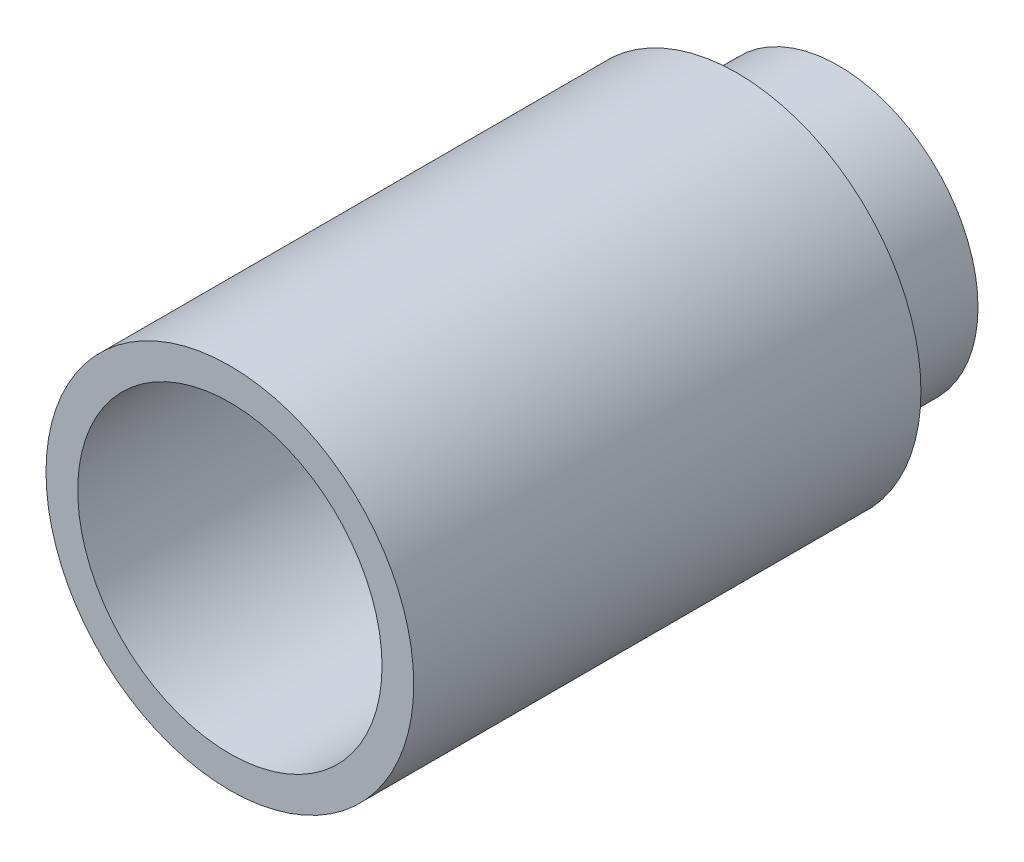
ISO-10303-21;
HEADER;
FILE_DESCRIPTION(('STEP AP214'),'2;1');
FILE_NAME('part.step','',(''),(''),'','','');
FILE_SCHEMA(('AUTOMOTIVE_DESIGN { 1 0 10303 214 1 1 1 1 }'));
ENDSEC;
DATA;
#1=APPLICATION_CONTEXT('core data for automotive mechanical design processes');
#2=APPLICATION_PROTOCOL_DEFINITION('international standard','automotive_design',2000,#1);
#3=PRODUCT_CONTEXT('',#1,'mechanical');
#4=PRODUCT('Part','Part','',(#3));
#5=PRODUCT_RELATED_PRODUCT_CATEGORY('part','',(#4));
#6=PRODUCT_DEFINITION_FORMATION('','',#4);
#7=PRODUCT_DEFINITION_CONTEXT('part definition',#1,'design');
#8=PRODUCT_DEFINITION('design','',#6,#7);
#9=PRODUCT_DEFINITION_SHAPE('','',#8);
#10=(LENGTH_UNIT() NAMED_UNIT(*) SI_UNIT(.MILLI.,.METRE.));
#11=(NAMED_UNIT(*) PLANE_ANGLE_UNIT() SI_UNIT($,.RADIAN.));
#12=(NAMED_UNIT(*) SI_UNIT($,.STERADIAN.) SOLID_ANGLE_UNIT());
#13=UNCERTAINTY_MEASURE_WITH_UNIT(LENGTH_MEASURE(1.E-05),#10,'distance_accuracy_value','');
#14=(GEOMETRIC_REPRESENTATION_CONTEXT(3) GLOBAL_UNCERTAINTY_ASSIGNED_CONTEXT((#13)) GLOBAL_UNIT_ASSIGNED_CONTEXT((#10,
#11,#12)) REPRESENTATION_CONTEXT('',''));
#15=CARTESIAN_POINT('',(0.,0.,0.));
#16=DIRECTION('',(0.,0.,1.));
#17=DIRECTION('',(1.,0.,0.));
#18=AXIS2_PLACEMENT_3D('',#15,#16,#17);
#19=CARTESIAN_POINT('',(0.,0.,0.));
#20=DIRECTION('',(0.,0.,0.999999999999999));
#21=DIRECTION('',(1.,0.,0.));
#22=AXIS2_PLACEMENT_3D('',#19,#20,#21);
#23=PLANE('',#22);
#24=CARTESIAN_POINT('',(0.,0.,0.));
#25=DIRECTION('',(0.,0.,0.999999999999999));
#26=DIRECTION('',(1.,0.,0.));
#27=AXIS2_PLACEMENT_3D('',#24,#25,#26);
#28=CIRCLE('',#27,14.5);
#29=CARTESIAN_POINT('',(-14.5,0.,0.));
#30=VERTEX_POINT('',#29);
#31=EDGE_CURVE('E43',#30,#30,#28,.T.);
#32=ORIENTED_EDGE('',*,*,#31,.F.);
#33=EDGE_LOOP('',(#32));
#34=FACE_BOUND('',#33,.T.);
#35=CARTESIAN_POINT('',(0.,0.,0.));
#36=DIRECTION('',(0.,0.,0.999999999999999));
#37=DIRECTION('',(1.,0.,0.));
#38=AXIS2_PLACEMENT_3D('',#35,#36,#37);
#39=CIRCLE('',#38,11.);
#40=CARTESIAN_POINT('',(11.,0.,0.));
#41=VERTEX_POINT('',#40);
#42=EDGE_CURVE('E10',#41,#41,#39,.F.);
#43=ORIENTED_EDGE('',*,*,#42,.F.);
#44=EDGE_LOOP('',(#43));
#45=FACE_BOUND('',#44,.T.);
#46=ADVANCED_FACE('F32',(#34,#45),#23,.F.);
#47=CARTESIAN_POINT('',(0.,0.,40.));
#48=DIRECTION('',(0.,0.,-0.999999999999999));
#49=DIRECTION('',(-1.,0.,0.));
#50=AXIS2_PLACEMENT_3D('',#47,#48,#49);
#51=CYLINDRICAL_SURFACE('',#50,14.5);
#52=CARTESIAN_POINT('',(0.,0.,40.));
#53=DIRECTION('',(0.,0.,0.999999999999999));
#54=DIRECTION('',(1.,0.,0.));
#55=AXIS2_PLACEMENT_3D('',#52,#53,#54);
#56=CIRCLE('',#55,14.5);
#57=CARTESIAN_POINT('',(-14.5,0.,40.));
#58=VERTEX_POINT('',#57);
#59=EDGE_CURVE('E39',#58,#58,#56,.T.);
#60=CARTESIAN_POINT('',(-14.5,0.,40.));
#61=CARTESIAN_POINT('',(-14.5,0.,39.5833333333333));
#62=CARTESIAN_POINT('',(-14.5,0.,39.1666666666666));
#63=CARTESIAN_POINT('',(-14.5,0.,38.3333333333333));
#64=CARTESIAN_POINT('',(-14.5,0.,37.9166666666666));
#65=CARTESIAN_POINT('',(-14.5,0.,37.0833333333333));
#66=CARTESIAN_POINT('',(-14.5,0.,36.6666666666666));
#67=CARTESIAN_POINT('',(-14.5,0.,35.8333333333333));
#68=CARTESIAN_POINT('',(-14.5,0.,35.4166666666666));
#69=CARTESIAN_POINT('',(-14.5,0.,34.5833333333333));
#70=CARTESIAN_POINT('',(-14.5,0.,34.1666666666666));
#71=CARTESIAN_POINT('',(-14.5,0.,33.3333333333333));
#72=CARTESIAN_POINT('',(-14.5,0.,32.9166666666666));
#73=CARTESIAN_POINT('',(-14.5,0.,32.0833333333333));
#74=CARTESIAN_POINT('',(-14.5,0.,31.6666666666666));
#75=CARTESIAN_POINT('',(-14.5,0.,30.8333333333333));
#76=CARTESIAN_POINT('',(-14.5,0.,30.4166666666666));
#77=CARTESIAN_POINT('',(-14.5,0.,29.5833333333333));
#78=CARTESIAN_POINT('',(-14.5,0.,29.1666666666666));
#79=CARTESIAN_POINT('',(-14.5,0.,28.3333333333333));
#80=CARTESIAN_POINT('',(-14.5,0.,27.9166666666666));
#81=CARTESIAN_POINT('',(-14.5,0.,27.0833333333333));
#82=CARTESIAN_POINT('',(-14.5,0.,26.6666666666666));
#83=CARTESIAN_POINT('',(-14.5,0.,25.8333333333333));
#84=CARTESIAN_POINT('',(-14.5,0.,25.4166666666667));
#85=CARTESIAN_POINT('',(-14.5,0.,24.5833333333333));
#86=CARTESIAN_POINT('',(-14.5,0.,24.1666666666667));
#87=CARTESIAN_POINT('',(-14.5,0.,23.3333333333333));
#88=CARTESIAN_POINT('',(-14.5,0.,22.9166666666666));
#89=CARTESIAN_POINT('',(-14.5,0.,22.0833333333333));
#90=CARTESIAN_POINT('',(-14.5,0.,21.6666666666667));
#91=CARTESIAN_POINT('',(-14.5,0.,20.8333333333333));
#92=CARTESIAN_POINT('',(-14.5,0.,20.4166666666667));
#93=CARTESIAN_POINT('',(-14.5,0.,19.5833333333333));
#94=CARTESIAN_POINT('',(-14.5,0.,19.1666666666667));
#95=CARTESIAN_POINT('',(-14.5,0.,18.3333333333333));
#96=CARTESIAN_POINT('',(-14.5,0.,17.9166666666667));
#97=CARTESIAN_POINT('',(-14.5,0.,17.0833333333333));
#98=CARTESIAN_POINT('',(-14.5,0.,16.6666666666667));
#99=CARTESIAN_POINT('',(-14.5,0.,15.8333333333333));
#100=CARTESIAN_POINT('',(-14.5,0.,15.4166666666667));
#101=CARTESIAN_POINT('',(-14.5,0.,14.5833333333333));
#102=CARTESIAN_POINT('',(-14.5,0.,14.1666666666667));
#103=CARTESIAN_POINT('',(-14.5,0.,13.3333333333333));
#104=CARTESIAN_POINT('',(-14.5,0.,12.9166666666667));
#105=CARTESIAN_POINT('',(-14.5,0.,12.0833333333333));
#106=CARTESIAN_POINT('',(-14.5,0.,11.6666666666667));
#107=CARTESIAN_POINT('',(-14.5,0.,10.8333333333333));
#108=CARTESIAN_POINT('',(-14.5,0.,10.4166666666667));
#109=CARTESIAN_POINT('',(-14.5,0.,9.58333333333333));
#110=CARTESIAN_POINT('',(-14.5,0.,9.16666666666666));
#111=CARTESIAN_POINT('',(-14.5,0.,8.33333333333333));
#112=CARTESIAN_POINT('',(-14.5,0.,7.91666666666666));
#113=CARTESIAN_POINT('',(-14.5,0.,7.08333333333333));
#114=CARTESIAN_POINT('',(-14.5,0.,6.66666666666666));
#115=CARTESIAN_POINT('',(-14.5,0.,5.83333333333333));
#116=CARTESIAN_POINT('',(-14.5,0.,5.41666666666666));
#117=CARTESIAN_POINT('',(-14.5,0.,4.58333333333333));
#118=CARTESIAN_POINT('',(-14.5,0.,4.16666666666667));
#119=CARTESIAN_POINT('',(-14.5,0.,3.33333333333334));
#120=CARTESIAN_POINT('',(-14.5,0.,2.91666666666667));
#121=CARTESIAN_POINT('',(-14.5,0.,2.08333333333334));
#122=CARTESIAN_POINT('',(-14.5,0.,1.66666666666667));
#123=CARTESIAN_POINT('',(-14.5,0.,0.833333333333334));
#124=CARTESIAN_POINT('',(-14.5,0.,0.416666666666667));
#125=CARTESIAN_POINT('',(-14.5,0.,0.));
#126=B_SPLINE_CURVE_WITH_KNOTS('',3,(#60,#61,#62,#63,#64,#65,#66,#67,#68,#69,#70,#71,#72,#73,
#74,#75,#76,#77,#78,#79,#80,#81,#82,#83,#84,#85,#86,#87,#88,#89,#90,#91,#92,#93,#94,#95,#96,#97,
#98,#99,#100,#101,#102,#103,#104,#105,#106,#107,#108,#109,#110,#111,#112,#113,#114,#115,#116,
#117,#118,#119,#120,#121,#122,#123,#124,#125),.UNSPECIFIED.,.F.,.F.,(4,2,2,2,2,2,2,2,2,2,2,2,2,
2,2,2,2,2,2,2,2,2,2,2,2,2,2,2,2,2,2,2,4),(0.,1.24999999999999,2.5,3.74999999999999,
4.99999999999999,6.24999999999999,7.49999999999999,8.74999999999999,9.99999999999999,11.25,12.5,
13.75,15.,16.25,17.5,18.75,20.,21.25,22.5,23.75,25.,26.25,27.5,28.75,30.,31.25,32.5,33.75,35.,
36.25,37.5,38.75,40.),.UNSPECIFIED.);
#127=EDGE_CURVE('BSEAM34',#58,#30,#126,.T.);
#128=ORIENTED_EDGE('',*,*,#59,.F.);
#129=ORIENTED_EDGE('',*,*,#31,.T.);
#130=ORIENTED_EDGE('',*,*,#127,.T.);
#131=ORIENTED_EDGE('',*,*,#127,.F.);
#132=EDGE_LOOP('',(#128,#130,#129,#131));
#133=FACE_BOUND('',#132,.T.);
#134=ADVANCED_FACE('F34',(#133),#51,.T.);
#135=CARTESIAN_POINT('',(0.,0.,40.));
#136=DIRECTION('',(0.,0.,0.999999999999999));
#137=DIRECTION('',(1.,0.,0.));
#138=AXIS2_PLACEMENT_3D('',#135,#136,#137);
#139=PLANE('',#138);
#140=CARTESIAN_POINT('',(0.,0.,40.));
#141=DIRECTION('',(0.,0.,0.999999999999999));
#142=DIRECTION('',(1.,0.,0.));
#143=AXIS2_PLACEMENT_3D('',#140,#141,#142);
#144=CIRCLE('',#143,12.);
#145=CARTESIAN_POINT('',(12.,0.,40.));
#146=VERTEX_POINT('',#145);
#147=EDGE_CURVE('E50',#146,#146,#144,.T.);
#148=ORIENTED_EDGE('',*,*,#147,.F.);
#149=EDGE_LOOP('',(#148));
#150=FACE_BOUND('',#149,.T.);
#151=ORIENTED_EDGE('',*,*,#59,.T.);
#152=EDGE_LOOP('',(#151));
#153=FACE_BOUND('',#152,.T.);
#154=ADVANCED_FACE('F114',(#150,#153),#139,.T.);
#155=CARTESIAN_POINT('',(0.,0.,8.));
#156=DIRECTION('',(0.,0.,0.999999999999999));
#157=DIRECTION('',(1.,0.,0.));
#158=AXIS2_PLACEMENT_3D('',#155,#156,#157);
#159=CYLINDRICAL_SURFACE('',#158,12.);
#160=CARTESIAN_POINT('',(0.,0.,8.));
#161=DIRECTION('',(0.,0.,0.999999999999999));
#162=DIRECTION('',(1.,0.,0.));
#163=AXIS2_PLACEMENT_3D('',#160,#161,#162);
#164=CIRCLE('',#163,12.);
#165=CARTESIAN_POINT('',(12.,0.,8.));
#166=VERTEX_POINT('',#165);
#167=EDGE_CURVE('E48',#166,#166,#164,.T.);
#168=CARTESIAN_POINT('',(12.,0.,8.));
#169=CARTESIAN_POINT('',(12.,0.,8.33333333333333));
#170=CARTESIAN_POINT('',(12.,0.,8.66666666666666));
#171=CARTESIAN_POINT('',(12.,0.,9.33333333333333));
#172=CARTESIAN_POINT('',(12.,0.,9.66666666666666));
#173=CARTESIAN_POINT('',(12.,0.,10.3333333333333));
#174=CARTESIAN_POINT('',(12.,0.,10.6666666666667));
#175=CARTESIAN_POINT('',(12.,0.,11.3333333333333));
#176=CARTESIAN_POINT('',(12.,0.,11.6666666666667));
#177=CARTESIAN_POINT('',(12.,0.,12.3333333333333));
#178=CARTESIAN_POINT('',(12.,0.,12.6666666666667));
#179=CARTESIAN_POINT('',(12.,0.,13.3333333333333));
#180=CARTESIAN_POINT('',(12.,0.,13.6666666666667));
#181=CARTESIAN_POINT('',(12.,0.,14.3333333333333));
#182=CARTESIAN_POINT('',(12.,0.,14.6666666666667));
#183=CARTESIAN_POINT('',(12.,0.,15.3333333333333));
#184=CARTESIAN_POINT('',(12.,0.,15.6666666666667));
#185=CARTESIAN_POINT('',(12.,0.,16.3333333333333));
#186=CARTESIAN_POINT('',(12.,0.,16.6666666666667));
#187=CARTESIAN_POINT('',(12.,0.,17.3333333333333));
#188=CARTESIAN_POINT('',(12.,0.,17.6666666666667));
#189=CARTESIAN_POINT('',(12.,0.,18.3333333333333));
#190=CARTESIAN_POINT('',(12.,0.,18.6666666666667));
#191=CARTESIAN_POINT('',(12.,0.,19.3333333333333));
#192=CARTESIAN_POINT('',(12.,0.,19.6666666666667));
#193=CARTESIAN_POINT('',(12.,0.,20.3333333333333));
#194=CARTESIAN_POINT('',(12.,0.,20.6666666666667));
#195=CARTESIAN_POINT('',(12.,0.,21.3333333333333));
#196=CARTESIAN_POINT('',(12.,0.,21.6666666666667));
#197=CARTESIAN_POINT('',(12.,0.,22.3333333333333));
#198=CARTESIAN_POINT('',(12.,0.,22.6666666666667));
#199=CARTESIAN_POINT('',(12.,0.,23.3333333333333));
#200=CARTESIAN_POINT('',(12.,0.,23.6666666666667));
#201=CARTESIAN_POINT('',(12.,0.,24.3333333333333));
#202=CARTESIAN_POINT('',(12.,0.,24.6666666666667));
#203=CARTESIAN_POINT('',(12.,0.,25.3333333333333));
#204=CARTESIAN_POINT('',(12.,0.,25.6666666666667));
#205=CARTESIAN_POINT('',(12.,0.,26.3333333333333));
#206=CARTESIAN_POINT('',(12.,0.,26.6666666666667));
#207=CARTESIAN_POINT('',(12.,0.,27.3333333333333));
#208=CARTESIAN_POINT('',(12.,0.,27.6666666666667));
#209=CARTESIAN_POINT('',(12.,0.,28.3333333333333));
#210=CARTESIAN_POINT('',(12.,0.,28.6666666666667));
#211=CARTESIAN_POINT('',(12.,0.,29.3333333333333));
#212=CARTESIAN_POINT('',(12.,0.,29.6666666666667));
#213=CARTESIAN_POINT('',(12.,0.,30.3333333333333));
#214=CARTESIAN_POINT('',(12.,0.,30.6666666666667));
#215=CARTESIAN_POINT('',(12.,0.,31.3333333333333));
#216=CARTESIAN_POINT('',(12.,0.,31.6666666666667));
#217=CARTESIAN_POINT('',(12.,0.,32.3333333333333));
#218=CARTESIAN_POINT('',(12.,0.,32.6666666666667));
#219=CARTESIAN_POINT('',(12.,0.,33.3333333333333));
#220=CARTESIAN_POINT('',(12.,0.,33.6666666666667));
#221=CARTESIAN_POINT('',(12.,0.,34.3333333333333));
#222=CARTESIAN_POINT('',(12.,0.,34.6666666666667));
#223=CARTESIAN_POINT('',(12.,0.,35.3333333333333));
#224=CARTESIAN_POINT('',(12.,0.,35.6666666666667));
#225=CARTESIAN_POINT('',(12.,0.,36.3333333333333));
#226=CARTESIAN_POINT('',(12.,0.,36.6666666666667));
#227=CARTESIAN_POINT('',(12.,0.,37.3333333333333));
#228=CARTESIAN_POINT('',(12.,0.,37.6666666666667));
#229=CARTESIAN_POINT('',(12.,0.,38.3333333333333));
#230=CARTESIAN_POINT('',(12.,0.,38.6666666666667));
#231=CARTESIAN_POINT('',(12.,0.,39.3333333333333));
#232=CARTESIAN_POINT('',(12.,0.,39.6666666666667));
#233=CARTESIAN_POINT('',(12.,0.,40.));
#234=B_SPLINE_CURVE_WITH_KNOTS('',3,(#168,#169,#170,#171,#172,#173,#174,#175,#176,#177,#178,
#179,#180,#181,#182,#183,#184,#185,#186,#187,#188,#189,#190,#191,#192,#193,#194,#195,#196,#197,
#198,#199,#200,#201,#202,#203,#204,#205,#206,#207,#208,#209,#210,#211,#212,#213,#214,#215,#216,
#217,#218,#219,#220,#221,#222,#223,#224,#225,#226,#227,#228,#229,#230,#231,#232,#233),
.UNSPECIFIED.,.F.,.F.,(4,2,2,2,2,2,2,2,2,2,2,2,2,2,2,2,2,2,2,2,2,2,2,2,2,2,2,2,2,2,2,2,4),(0.,
0.999999999999999,2.,3.,4.,5.,6.,7.,7.99999999999999,9.,10.,11.,12.,13.,14.,15.,16.,17.,18.,19.,
20.,21.,22.,23.,24.,25.,26.,27.,28.,29.,30.,31.,32.),.UNSPECIFIED.);
#235=EDGE_CURVE('BSEAM106',#166,#146,#234,.T.);
#236=ORIENTED_EDGE('',*,*,#167,.F.);
#237=ORIENTED_EDGE('',*,*,#147,.T.);
#238=ORIENTED_EDGE('',*,*,#235,.T.);
#239=ORIENTED_EDGE('',*,*,#235,.F.);
#240=EDGE_LOOP('',(#236,#238,#237,#239));
#241=FACE_BOUND('',#240,.T.);
#242=ADVANCED_FACE('F106',(#241),#159,.F.);
#243=CARTESIAN_POINT('',(0.,0.,8.));
#244=DIRECTION('',(0.,0.,0.999999999999999));
#245=DIRECTION('',(1.,0.,0.));
#246=AXIS2_PLACEMENT_3D('',#243,#244,#245);
#247=PLANE('',#246);
#248=CARTESIAN_POINT('',(0.,0.,8.));
#249=DIRECTION('',(0.,0.,0.999999999999999));
#250=DIRECTION('',(1.,0.,0.));
#251=AXIS2_PLACEMENT_3D('',#248,#249,#250);
#252=CIRCLE('',#251,9.5);
#253=CARTESIAN_POINT('',(9.5,0.,8.));
#254=VERTEX_POINT('',#253);
#255=EDGE_CURVE('E59',#254,#254,#252,.T.);
#256=ORIENTED_EDGE('',*,*,#255,.F.);
#257=EDGE_LOOP('',(#256));
#258=FACE_BOUND('',#257,.T.);
#259=ORIENTED_EDGE('',*,*,#167,.T.);
#260=EDGE_LOOP('',(#259));
#261=FACE_BOUND('',#260,.T.);
#262=ADVANCED_FACE('F101',(#258,#261),#247,.T.);
#263=CARTESIAN_POINT('',(0.,0.,-7.99999999999999));
#264=DIRECTION('',(0.,0.,0.999999999999999));
#265=DIRECTION('',(1.,0.,0.));
#266=AXIS2_PLACEMENT_3D('',#263,#264,#265);
#267=CYLINDRICAL_SURFACE('',#266,11.);
#268=CARTESIAN_POINT('',(0.,0.,-7.99999999999999));
#269=DIRECTION('',(0.,0.,-0.999999999999999));
#270=DIRECTION('',(-1.,0.,0.));
#271=AXIS2_PLACEMENT_3D('',#268,#269,#270);
#272=CIRCLE('',#271,11.);
#273=CARTESIAN_POINT('',(11.,0.,-7.99999999999999));
#274=VERTEX_POINT('',#273);
#275=EDGE_CURVE('E53',#274,#274,#272,.T.);
#276=CARTESIAN_POINT('',(11.,0.,-7.99999999999999));
#277=CARTESIAN_POINT('',(11.,0.,-7.91666666666666));
#278=CARTESIAN_POINT('',(11.,0.,-7.83333333333333));
#279=CARTESIAN_POINT('',(11.,0.,-7.66666666666666));
#280=CARTESIAN_POINT('',(11.,0.,-7.58333333333333));
#281=CARTESIAN_POINT('',(11.,0.,-7.41666666666666));
#282=CARTESIAN_POINT('',(11.,0.,-7.33333333333333));
#283=CARTESIAN_POINT('',(11.,0.,-7.16666666666666));
#284=CARTESIAN_POINT('',(11.,0.,-7.08333333333333));
#285=CARTESIAN_POINT('',(11.,0.,-6.91666666666666));
#286=CARTESIAN_POINT('',(11.,0.,-6.83333333333333));
#287=CARTESIAN_POINT('',(11.,0.,-6.66666666666666));
#288=CARTESIAN_POINT('',(11.,0.,-6.58333333333333));
#289=CARTESIAN_POINT('',(11.,0.,-6.41666666666666));
#290=CARTESIAN_POINT('',(11.,0.,-6.33333333333333));
#291=CARTESIAN_POINT('',(11.,0.,-6.16666666666666));
#292=CARTESIAN_POINT('',(11.,0.,-6.08333333333333));
#293=CARTESIAN_POINT('',(11.,0.,-5.91666666666666));
#294=CARTESIAN_POINT('',(11.,0.,-5.83333333333333));
#295=CARTESIAN_POINT('',(11.,0.,-5.66666666666666));
#296=CARTESIAN_POINT('',(11.,0.,-5.58333333333333));
#297=CARTESIAN_POINT('',(11.,0.,-5.41666666666666));
#298=CARTESIAN_POINT('',(11.,0.,-5.33333333333333));
#299=CARTESIAN_POINT('',(11.,0.,-5.16666666666666));
#300=CARTESIAN_POINT('',(11.,0.,-5.08333333333333));
#301=CARTESIAN_POINT('',(11.,0.,-4.91666666666666));
#302=CARTESIAN_POINT('',(11.,0.,-4.83333333333333));
#303=CARTESIAN_POINT('',(11.,0.,-4.66666666666666));
#304=CARTESIAN_POINT('',(11.,0.,-4.58333333333333));
#305=CARTESIAN_POINT('',(11.,0.,-4.41666666666666));
#306=CARTESIAN_POINT('',(11.,0.,-4.33333333333333));
#307=CARTESIAN_POINT('',(11.,0.,-4.16666666666666));
#308=CARTESIAN_POINT('',(11.,0.,-4.08333333333333));
#309=CARTESIAN_POINT('',(11.,0.,-3.91666666666666));
#310=CARTESIAN_POINT('',(11.,0.,-3.83333333333333));
#311=CARTESIAN_POINT('',(11.,0.,-3.66666666666666));
#312=CARTESIAN_POINT('',(11.,0.,-3.58333333333333));
#313=CARTESIAN_POINT('',(11.,0.,-3.41666666666666));
#314=CARTESIAN_POINT('',(11.,0.,-3.33333333333333));
#315=CARTESIAN_POINT('',(11.,0.,-3.16666666666666));
#316=CARTESIAN_POINT('',(11.,0.,-3.08333333333333));
#317=CARTESIAN_POINT('',(11.,0.,-2.91666666666666));
#318=CARTESIAN_POINT('',(11.,0.,-2.83333333333333));
#319=CARTESIAN_POINT('',(11.,0.,-2.66666666666666));
#320=CARTESIAN_POINT('',(11.,0.,-2.58333333333333));
#321=CARTESIAN_POINT('',(11.,0.,-2.41666666666666));
#322=CARTESIAN_POINT('',(11.,0.,-2.33333333333333));
#323=CARTESIAN_POINT('',(11.,0.,-2.16666666666666));
#324=CARTESIAN_POINT('',(11.,0.,-2.08333333333333));
#325=CARTESIAN_POINT('',(11.,0.,-1.91666666666666));
#326=CARTESIAN_POINT('',(11.,0.,-1.83333333333333));
#327=CARTESIAN_POINT('',(11.,0.,-1.66666666666666));
#328=CARTESIAN_POINT('',(11.,0.,-1.58333333333333));
#329=CARTESIAN_POINT('',(11.,0.,-1.41666666666666));
#330=CARTESIAN_POINT('',(11.,0.,-1.33333333333333));
#331=CARTESIAN_POINT('',(11.,0.,-1.16666666666666));
#332=CARTESIAN_POINT('',(11.,0.,-1.08333333333333));
#333=CARTESIAN_POINT('',(11.,0.,-0.916666666666663));
#334=CARTESIAN_POINT('',(11.,0.,-0.83333333333333));
#335=CARTESIAN_POINT('',(11.,0.,-0.666666666666664));
#336=CARTESIAN_POINT('',(11.,0.,-0.583333333333331));
#337=CARTESIAN_POINT('',(11.,0.,-0.416666666666664));
#338=CARTESIAN_POINT('',(11.,0.,-0.333333333333331));
#339=CARTESIAN_POINT('',(11.,0.,-0.166666666666664));
#340=CARTESIAN_POINT('',(11.,0.,-0.0833333333333313));
#341=CARTESIAN_POINT('',(11.,0.,0.));
#342=B_SPLINE_CURVE_WITH_KNOTS('',3,(#276,#277,#278,#279,#280,#281,#282,#283,#284,#285,#286,
#287,#288,#289,#290,#291,#292,#293,#294,#295,#296,#297,#298,#299,#300,#301,#302,#303,#304,#305,
#306,#307,#308,#309,#310,#311,#312,#313,#314,#315,#316,#317,#318,#319,#320,#321,#322,#323,#324,
#325,#326,#327,#328,#329,#330,#331,#332,#333,#334,#335,#336,#337,#338,#339,#340,#341),
.UNSPECIFIED.,.F.,.F.,(4,2,2,2,2,2,2,2,2,2,2,2,2,2,2,2,2,2,2,2,2,2,2,2,2,2,2,2,2,2,2,2,4),(0.,
0.250000000000001,0.5,0.750000000000001,1.,1.25,1.5,1.75,2.,2.25,2.5,2.75,3.,3.25,3.5,3.75,4.,
4.25,4.5,4.75,5.,5.25,5.5,5.75,6.,6.25,6.5,6.75,7.,7.25,7.5,7.75,7.99999999999999),.UNSPECIFIED.);
#343=EDGE_CURVE('BSEAM96',#274,#41,#342,.T.);
#344=ORIENTED_EDGE('',*,*,#275,.F.);
#345=ORIENTED_EDGE('',*,*,#42,.T.);
#346=ORIENTED_EDGE('',*,*,#343,.T.);
#347=ORIENTED_EDGE('',*,*,#343,.F.);
#348=EDGE_LOOP('',(#344,#346,#345,#347));
#349=FACE_BOUND('',#348,.T.);
#350=ADVANCED_FACE('F96',(#349),#267,.T.);
#351=CARTESIAN_POINT('',(0.,0.,-7.99999999999999));
#352=DIRECTION('',(0.,0.,-0.999999999999999));
#353=DIRECTION('',(-1.,0.,0.));
#354=AXIS2_PLACEMENT_3D('',#351,#352,#353);
#355=PLANE('',#354);
#356=CARTESIAN_POINT('',(0.,0.,-7.99999999999999));
#357=DIRECTION('',(0.,0.,-0.999999999999999));
#358=DIRECTION('',(-1.,0.,0.));
#359=AXIS2_PLACEMENT_3D('',#356,#357,#358);
#360=CIRCLE('',#359,9.5);
#361=CARTESIAN_POINT('',(-9.5,0.,-7.99999999999999));
#362=VERTEX_POINT('',#361);
#363=EDGE_CURVE('E65',#362,#362,#360,.T.);
#364=ORIENTED_EDGE('',*,*,#363,.F.);
#365=EDGE_LOOP('',(#364));
#366=FACE_BOUND('',#365,.T.);
#367=ORIENTED_EDGE('',*,*,#275,.T.);
#368=EDGE_LOOP('',(#367));
#369=FACE_BOUND('',#368,.T.);
#370=ADVANCED_FACE('F92',(#366,#369),#355,.T.);
#371=CARTESIAN_POINT('',(0.,0.,2.));
#372=DIRECTION('',(0.,0.,0.999999999999999));
#373=DIRECTION('',(1.,0.,0.));
#374=AXIS2_PLACEMENT_3D('',#371,#372,#373);
#375=CYLINDRICAL_SURFACE('',#374,9.5);
#376=CARTESIAN_POINT('',(0.,0.,2.));
#377=DIRECTION('',(0.,0.,0.999999999999999));
#378=DIRECTION('',(1.,0.,0.));
#379=AXIS2_PLACEMENT_3D('',#376,#377,#378);
#380=CIRCLE('',#379,9.5);
#381=CARTESIAN_POINT('',(9.5,0.,2.));
#382=VERTEX_POINT('',#381);
#383=EDGE_CURVE('E58',#382,#382,#380,.T.);
#384=CARTESIAN_POINT('',(9.5,0.,2.));
#385=CARTESIAN_POINT('',(9.5,0.,2.0625));
#386=CARTESIAN_POINT('',(9.5,0.,2.125));
#387=CARTESIAN_POINT('',(9.5,0.,2.25));
#388=CARTESIAN_POINT('',(9.5,0.,2.3125));
#389=CARTESIAN_POINT('',(9.5,0.,2.4375));
#390=CARTESIAN_POINT('',(9.5,0.,2.5));
#391=CARTESIAN_POINT('',(9.5,0.,2.625));
#392=CARTESIAN_POINT('',(9.5,0.,2.6875));
#393=CARTESIAN_POINT('',(9.5,0.,2.8125));
#394=CARTESIAN_POINT('',(9.5,0.,2.875));
#395=CARTESIAN_POINT('',(9.5,0.,3.));
#396=CARTESIAN_POINT('',(9.5,0.,3.0625));
#397=CARTESIAN_POINT('',(9.5,0.,3.1875));
#398=CARTESIAN_POINT('',(9.5,0.,3.25));
#399=CARTESIAN_POINT('',(9.5,0.,3.375));
#400=CARTESIAN_POINT('',(9.5,0.,3.4375));
#401=CARTESIAN_POINT('',(9.5,0.,3.5625));
#402=CARTESIAN_POINT('',(9.5,0.,3.625));
#403=CARTESIAN_POINT('',(9.5,0.,3.75));
#404=CARTESIAN_POINT('',(9.5,0.,3.8125));
#405=CARTESIAN_POINT('',(9.5,0.,3.9375));
#406=CARTESIAN_POINT('',(9.5,0.,4.));
#407=CARTESIAN_POINT('',(9.5,0.,4.125));
#408=CARTESIAN_POINT('',(9.5,0.,4.1875));
#409=CARTESIAN_POINT('',(9.5,0.,4.3125));
#410=CARTESIAN_POINT('',(9.5,0.,4.375));
#411=CARTESIAN_POINT('',(9.5,0.,4.5));
#412=CARTESIAN_POINT('',(9.5,0.,4.5625));
#413=CARTESIAN_POINT('',(9.5,0.,4.6875));
#414=CARTESIAN_POINT('',(9.5,0.,4.75));
#415=CARTESIAN_POINT('',(9.5,0.,4.875));
#416=CARTESIAN_POINT('',(9.5,0.,4.9375));
#417=CARTESIAN_POINT('',(9.5,0.,5.0625));
#418=CARTESIAN_POINT('',(9.5,0.,5.125));
#419=CARTESIAN_POINT('',(9.5,0.,5.25));
#420=CARTESIAN_POINT('',(9.5,0.,5.3125));
#421=CARTESIAN_POINT('',(9.5,0.,5.4375));
#422=CARTESIAN_POINT('',(9.5,0.,5.5));
#423=CARTESIAN_POINT('',(9.5,0.,5.625));
#424=CARTESIAN_POINT('',(9.5,0.,5.6875));
#425=CARTESIAN_POINT('',(9.5,0.,5.8125));
#426=CARTESIAN_POINT('',(9.5,0.,5.875));
#427=CARTESIAN_POINT('',(9.5,0.,6.));
#428=CARTESIAN_POINT('',(9.5,0.,6.0625));
#429=CARTESIAN_POINT('',(9.5,0.,6.1875));
#430=CARTESIAN_POINT('',(9.5,0.,6.25));
#431=CARTESIAN_POINT('',(9.5,0.,6.375));
#432=CARTESIAN_POINT('',(9.5,0.,6.4375));
#433=CARTESIAN_POINT('',(9.5,0.,6.5625));
#434=CARTESIAN_POINT('',(9.5,0.,6.625));
#435=CARTESIAN_POINT('',(9.5,0.,6.75));
#436=CARTESIAN_POINT('',(9.5,0.,6.8125));
#437=CARTESIAN_POINT('',(9.5,0.,6.9375));
#438=CARTESIAN_POINT('',(9.5,0.,7.));
#439=CARTESIAN_POINT('',(9.5,0.,7.125));
#440=CARTESIAN_POINT('',(9.5,0.,7.1875));
#441=CARTESIAN_POINT('',(9.5,0.,7.3125));
#442=CARTESIAN_POINT('',(9.5,0.,7.375));
#443=CARTESIAN_POINT('',(9.5,0.,7.5));
#444=CARTESIAN_POINT('',(9.5,0.,7.5625));
#445=CARTESIAN_POINT('',(9.5,0.,7.6875));
#446=CARTESIAN_POINT('',(9.5,0.,7.75));
#447=CARTESIAN_POINT('',(9.5,0.,7.875));
#448=CARTESIAN_POINT('',(9.5,0.,7.9375));
#449=CARTESIAN_POINT('',(9.5,0.,8.));
#450=B_SPLINE_CURVE_WITH_KNOTS('',3,(#384,#385,#386,#387,#388,#389,#390,#391,#392,#393,#394,
#395,#396,#397,#398,#399,#400,#401,#402,#403,#404,#405,#406,#407,#408,#409,#410,#411,#412,#413,
#414,#415,#416,#417,#418,#419,#420,#421,#422,#423,#424,#425,#426,#427,#428,#429,#430,#431,#432,
#433,#434,#435,#436,#437,#438,#439,#440,#441,#442,#443,#444,#445,#446,#447,#448,#449),
.UNSPECIFIED.,.F.,.F.,(4,2,2,2,2,2,2,2,2,2,2,2,2,2,2,2,2,2,2,2,2,2,2,2,2,2,2,2,2,2,2,2,4),(0.,
0.1875,0.375,0.5625,0.75,0.9375,1.125,1.3125,1.5,1.6875,1.875,2.0625,2.25,2.4375,2.625,2.8125,
3.,3.1875,3.375,3.5625,3.75,3.9375,4.125,4.3125,4.5,4.6875,4.875,5.0625,5.25,5.4375,5.625,
5.8125,6.),.UNSPECIFIED.);
#451=EDGE_CURVE('BSEAM95',#382,#254,#450,.T.);
#452=ORIENTED_EDGE('',*,*,#383,.F.);
#453=ORIENTED_EDGE('',*,*,#255,.T.);
#454=ORIENTED_EDGE('',*,*,#451,.T.);
#455=ORIENTED_EDGE('',*,*,#451,.F.);
#456=EDGE_LOOP('',(#452,#454,#453,#455));
#457=FACE_BOUND('',#456,.T.);
#458=ADVANCED_FACE('F95',(#457),#375,.F.);
#459=CARTESIAN_POINT('',(0.,0.,2.));
#460=DIRECTION('',(0.,0.,0.999999999999999));
#461=DIRECTION('',(1.,0.,0.));
#462=AXIS2_PLACEMENT_3D('',#459,#460,#461);
#463=PLANE('',#462);
#464=CARTESIAN_POINT('',(0.,0.,2.));
#465=DIRECTION('',(0.,0.,0.999999999999999));
#466=DIRECTION('',(1.,0.,0.));
#467=AXIS2_PLACEMENT_3D('',#464,#465,#466);
#468=CIRCLE('',#467,3.5);
#469=CARTESIAN_POINT('',(-3.5,0.,2.));
#470=VERTEX_POINT('',#469);
#471=EDGE_CURVE('E68',#470,#470,#468,.T.);
#472=ORIENTED_EDGE('',*,*,#471,.F.);
#473=EDGE_LOOP('',(#472));
#474=FACE_BOUND('',#473,.T.);
#475=ORIENTED_EDGE('',*,*,#383,.T.);
#476=EDGE_LOOP('',(#475));
#477=FACE_BOUND('',#476,.T.);
#478=ADVANCED_FACE('F88',(#474,#477),#463,.T.);
#479=CARTESIAN_POINT('',(0.,0.,-2.));
#480=DIRECTION('',(0.,0.,-0.999999999999999));
#481=DIRECTION('',(-1.,0.,0.));
#482=AXIS2_PLACEMENT_3D('',#479,#480,#481);
#483=CYLINDRICAL_SURFACE('',#482,9.5);
#484=CARTESIAN_POINT('',(0.,0.,-2.));
#485=DIRECTION('',(0.,0.,-0.999999999999999));
#486=DIRECTION('',(-1.,0.,0.));
#487=AXIS2_PLACEMENT_3D('',#484,#485,#486);
#488=CIRCLE('',#487,9.5);
#489=CARTESIAN_POINT('',(-9.5,0.,-2.));
#490=VERTEX_POINT('',#489);
#491=EDGE_CURVE('E62',#490,#490,#488,.T.);
#492=CARTESIAN_POINT('',(-9.5,0.,-2.));
#493=CARTESIAN_POINT('',(-9.5,0.,-2.0625));
#494=CARTESIAN_POINT('',(-9.5,0.,-2.125));
#495=CARTESIAN_POINT('',(-9.5,0.,-2.25));
#496=CARTESIAN_POINT('',(-9.5,0.,-2.3125));
#497=CARTESIAN_POINT('',(-9.5,0.,-2.4375));
#498=CARTESIAN_POINT('',(-9.5,0.,-2.5));
#499=CARTESIAN_POINT('',(-9.5,0.,-2.625));
#500=CARTESIAN_POINT('',(-9.5,0.,-2.6875));
#501=CARTESIAN_POINT('',(-9.5,0.,-2.8125));
#502=CARTESIAN_POINT('',(-9.5,0.,-2.875));
#503=CARTESIAN_POINT('',(-9.5,0.,-3.));
#504=CARTESIAN_POINT('',(-9.5,0.,-3.0625));
#505=CARTESIAN_POINT('',(-9.5,0.,-3.1875));
#506=CARTESIAN_POINT('',(-9.5,0.,-3.25));
#507=CARTESIAN_POINT('',(-9.5,0.,-3.375));
#508=CARTESIAN_POINT('',(-9.5,0.,-3.4375));
#509=CARTESIAN_POINT('',(-9.5,0.,-3.5625));
#510=CARTESIAN_POINT('',(-9.5,0.,-3.625));
#511=CARTESIAN_POINT('',(-9.5,0.,-3.75));
#512=CARTESIAN_POINT('',(-9.5,0.,-3.8125));
#513=CARTESIAN_POINT('',(-9.5,0.,-3.9375));
#514=CARTESIAN_POINT('',(-9.5,0.,-4.));
#515=CARTESIAN_POINT('',(-9.5,0.,-4.125));
#516=CARTESIAN_POINT('',(-9.5,0.,-4.1875));
#517=CARTESIAN_POINT('',(-9.5,0.,-4.3125));
#518=CARTESIAN_POINT('',(-9.5,0.,-4.375));
#519=CARTESIAN_POINT('',(-9.5,0.,-4.5));
#520=CARTESIAN_POINT('',(-9.5,0.,-4.5625));
#521=CARTESIAN_POINT('',(-9.5,0.,-4.6875));
#522=CARTESIAN_POINT('',(-9.5,0.,-4.75));
#523=CARTESIAN_POINT('',(-9.5,0.,-4.875));
#524=CARTESIAN_POINT('',(-9.5,0.,-4.9375));
#525=CARTESIAN_POINT('',(-9.5,0.,-5.0625));
#526=CARTESIAN_POINT('',(-9.5,0.,-5.125));
#527=CARTESIAN_POINT('',(-9.5,0.,-5.25));
#528=CARTESIAN_POINT('',(-9.5,0.,-5.3125));
#529=CARTESIAN_POINT('',(-9.5,0.,-5.4375));
#530=CARTESIAN_POINT('',(-9.5,0.,-5.5));
#531=CARTESIAN_POINT('',(-9.5,0.,-5.625));
#532=CARTESIAN_POINT('',(-9.5,0.,-5.68749999999999));
#533=CARTESIAN_POINT('',(-9.5,0.,-5.81249999999999));
#534=CARTESIAN_POINT('',(-9.5,0.,-5.87499999999999));
#535=CARTESIAN_POINT('',(-9.5,0.,-5.99999999999999));
#536=CARTESIAN_POINT('',(-9.5,0.,-6.06249999999999));
#537=CARTESIAN_POINT('',(-9.5,0.,-6.18749999999999));
#538=CARTESIAN_POINT('',(-9.5,0.,-6.25));
#539=CARTESIAN_POINT('',(-9.5,0.,-6.375));
#540=CARTESIAN_POINT('',(-9.5,0.,-6.43749999999999));
#541=CARTESIAN_POINT('',(-9.5,0.,-6.56249999999999));
#542=CARTESIAN_POINT('',(-9.5,0.,-6.62499999999999));
#543=CARTESIAN_POINT('',(-9.5,0.,-6.74999999999999));
#544=CARTESIAN_POINT('',(-9.5,0.,-6.81249999999999));
#545=CARTESIAN_POINT('',(-9.5,0.,-6.93749999999999));
#546=CARTESIAN_POINT('',(-9.5,0.,-6.99999999999999));
#547=CARTESIAN_POINT('',(-9.5,0.,-7.12499999999999));
#548=CARTESIAN_POINT('',(-9.5,0.,-7.18749999999999));
#549=CARTESIAN_POINT('',(-9.5,0.,-7.31249999999999));
#550=CARTESIAN_POINT('',(-9.5,0.,-7.37499999999999));
#551=CARTESIAN_POINT('',(-9.5,0.,-7.49999999999999));
#552=CARTESIAN_POINT('',(-9.5,0.,-7.56249999999999));
#553=CARTESIAN_POINT('',(-9.5,0.,-7.68749999999999));
#554=CARTESIAN_POINT('',(-9.5,0.,-7.74999999999999));
#555=CARTESIAN_POINT('',(-9.5,0.,-7.87499999999999));
#556=CARTESIAN_POINT('',(-9.5,0.,-7.93749999999999));
#557=CARTESIAN_POINT('',(-9.5,0.,-7.99999999999999));
#558=B_SPLINE_CURVE_WITH_KNOTS('',3,(#492,#493,#494,#495,#496,#497,#498,#499,#500,#501,#502,
#503,#504,#505,#506,#507,#508,#509,#510,#511,#512,#513,#514,#515,#516,#517,#518,#519,#520,#521,
#522,#523,#524,#525,#526,#527,#528,#529,#530,#531,#532,#533,#534,#535,#536,#537,#538,#539,#540,
#541,#542,#543,#544,#545,#546,#547,#548,#549,#550,#551,#552,#553,#554,#555,#556,#557),
.UNSPECIFIED.,.F.,.F.,(4,2,2,2,2,2,2,2,2,2,2,2,2,2,2,2,2,2,2,2,2,2,2,2,2,2,2,2,2,2,2,2,4),(0.,
0.1875,0.375,0.5625,0.75,0.9375,1.125,1.3125,1.5,1.6875,1.875,2.0625,2.25,2.4375,2.625,2.8125,
3.,3.1875,3.375,3.5625,3.75,3.9375,4.125,4.3125,4.5,4.6875,4.875,5.0625,5.25,5.4375,5.625,
5.8125,6.),.UNSPECIFIED.);
#559=EDGE_CURVE('BSEAM82',#490,#362,#558,.T.);
#560=ORIENTED_EDGE('',*,*,#491,.F.);
#561=ORIENTED_EDGE('',*,*,#363,.T.);
#562=ORIENTED_EDGE('',*,*,#559,.T.);
#563=ORIENTED_EDGE('',*,*,#559,.F.);
#564=EDGE_LOOP('',(#560,#562,#561,#563));
#565=FACE_BOUND('',#564,.T.);
#566=ADVANCED_FACE('F82',(#565),#483,.F.);
#567=CARTESIAN_POINT('',(0.,0.,-2.));
#568=DIRECTION('',(0.,0.,-0.999999999999999));
#569=DIRECTION('',(-1.,0.,0.));
#570=AXIS2_PLACEMENT_3D('',#567,#568,#569);
#571=PLANE('',#570);
#572=CARTESIAN_POINT('',(0.,0.,-2.));
#573=DIRECTION('',(0.,0.,-0.999999999999999));
#574=DIRECTION('',(-1.,0.,0.));
#575=AXIS2_PLACEMENT_3D('',#572,#573,#574);
#576=CIRCLE('',#575,3.5);
#577=CARTESIAN_POINT('',(-3.5,0.,-2.));
#578=VERTEX_POINT('',#577);
#579=EDGE_CURVE('E73',#578,#578,#576,.T.);
#580=ORIENTED_EDGE('',*,*,#579,.F.);
#581=EDGE_LOOP('',(#580));
#582=FACE_BOUND('',#581,.T.);
#583=ORIENTED_EDGE('',*,*,#491,.T.);
#584=EDGE_LOOP('',(#583));
#585=FACE_BOUND('',#584,.T.);
#586=ADVANCED_FACE('F79',(#582,#585),#571,.T.);
#587=CARTESIAN_POINT('',(0.,0.,4.));
#588=DIRECTION('',(0.,0.,-0.999999999999999));
#589=DIRECTION('',(-1.,0.,0.));
#590=AXIS2_PLACEMENT_3D('',#587,#588,#589);
#591=CYLINDRICAL_SURFACE('',#590,3.5);
#592=CARTESIAN_POINT('',(-3.5,0.,2.));
#593=CARTESIAN_POINT('',(-3.5,0.,1.95833333333333));
#594=CARTESIAN_POINT('',(-3.5,0.,1.91666666666667));
#595=CARTESIAN_POINT('',(-3.5,0.,1.83333333333333));
#596=CARTESIAN_POINT('',(-3.5,0.,1.79166666666667));
#597=CARTESIAN_POINT('',(-3.5,0.,1.70833333333333));
#598=CARTESIAN_POINT('',(-3.5,0.,1.66666666666667));
#599=CARTESIAN_POINT('',(-3.5,0.,1.58333333333333));
#600=CARTESIAN_POINT('',(-3.5,0.,1.54166666666667));
#601=CARTESIAN_POINT('',(-3.5,0.,1.45833333333333));
#602=CARTESIAN_POINT('',(-3.5,0.,1.41666666666667));
#603=CARTESIAN_POINT('',(-3.5,0.,1.33333333333333));
#604=CARTESIAN_POINT('',(-3.5,0.,1.29166666666667));
#605=CARTESIAN_POINT('',(-3.5,0.,1.20833333333333));
#606=CARTESIAN_POINT('',(-3.5,0.,1.16666666666667));
#607=CARTESIAN_POINT('',(-3.5,0.,1.08333333333333));
#608=CARTESIAN_POINT('',(-3.5,0.,1.04166666666667));
#609=CARTESIAN_POINT('',(-3.5,0.,0.958333333333334));
#610=CARTESIAN_POINT('',(-3.5,0.,0.916666666666668));
#611=CARTESIAN_POINT('',(-3.5,0.,0.833333333333334));
#612=CARTESIAN_POINT('',(-3.5,0.,0.791666666666668));
#613=CARTESIAN_POINT('',(-3.5,0.,0.708333333333335));
#614=CARTESIAN_POINT('',(-3.5,0.,0.666666666666668));
#615=CARTESIAN_POINT('',(-3.5,0.,0.583333333333335));
#616=CARTESIAN_POINT('',(-3.5,0.,0.541666666666668));
#617=CARTESIAN_POINT('',(-3.5,0.,0.458333333333335));
#618=CARTESIAN_POINT('',(-3.5,0.,0.416666666666668));
#619=CARTESIAN_POINT('',(-3.5,0.,0.333333333333335));
#620=CARTESIAN_POINT('',(-3.5,0.,0.291666666666668));
#621=CARTESIAN_POINT('',(-3.5,0.,0.208333333333335));
#622=CARTESIAN_POINT('',(-3.5,0.,0.166666666666669));
#623=CARTESIAN_POINT('',(-3.5,0.,0.0833333333333351));
#624=CARTESIAN_POINT('',(-3.5,0.,0.0416666666666684));
#625=CARTESIAN_POINT('',(-3.5,0.,-0.041666666666665));
#626=CARTESIAN_POINT('',(-3.5,0.,-0.0833333333333317));
#627=CARTESIAN_POINT('',(-3.5,0.,-0.166666666666665));
#628=CARTESIAN_POINT('',(-3.5,0.,-0.208333333333332));
#629=CARTESIAN_POINT('',(-3.5,0.,-0.291666666666665));
#630=CARTESIAN_POINT('',(-3.5,0.,-0.333333333333332));
#631=CARTESIAN_POINT('',(-3.5,0.,-0.416666666666665));
#632=CARTESIAN_POINT('',(-3.5,0.,-0.458333333333331));
#633=CARTESIAN_POINT('',(-3.5,0.,-0.541666666666665));
#634=CARTESIAN_POINT('',(-3.5,0.,-0.583333333333331));
#635=CARTESIAN_POINT('',(-3.5,0.,-0.666666666666664));
#636=CARTESIAN_POINT('',(-3.5,0.,-0.708333333333331));
#637=CARTESIAN_POINT('',(-3.5,0.,-0.791666666666664));
#638=CARTESIAN_POINT('',(-3.5,0.,-0.833333333333331));
#639=CARTESIAN_POINT('',(-3.5,0.,-0.916666666666664));
#640=CARTESIAN_POINT('',(-3.5,0.,-0.958333333333331));
#641=CARTESIAN_POINT('',(-3.5,0.,-1.04166666666666));
#642=CARTESIAN_POINT('',(-3.5,0.,-1.08333333333333));
#643=CARTESIAN_POINT('',(-3.5,0.,-1.16666666666666));
#644=CARTESIAN_POINT('',(-3.5,0.,-1.20833333333333));
#645=CARTESIAN_POINT('',(-3.5,0.,-1.29166666666666));
#646=CARTESIAN_POINT('',(-3.5,0.,-1.33333333333333));
#647=CARTESIAN_POINT('',(-3.5,0.,-1.41666666666666));
#648=CARTESIAN_POINT('',(-3.5,0.,-1.45833333333333));
#649=CARTESIAN_POINT('',(-3.5,0.,-1.54166666666666));
#650=CARTESIAN_POINT('',(-3.5,0.,-1.58333333333333));
#651=CARTESIAN_POINT('',(-3.5,0.,-1.66666666666666));
#652=CARTESIAN_POINT('',(-3.5,0.,-1.70833333333333));
#653=CARTESIAN_POINT('',(-3.5,0.,-1.79166666666666));
#654=CARTESIAN_POINT('',(-3.5,0.,-1.83333333333333));
#655=CARTESIAN_POINT('',(-3.5,0.,-1.91666666666666));
#656=CARTESIAN_POINT('',(-3.5,0.,-1.95833333333333));
#657=CARTESIAN_POINT('',(-3.5,0.,-2.));
#658=B_SPLINE_CURVE_WITH_KNOTS('',3,(#592,#593,#594,#595,#596,#597,#598,#599,#600,#601,#602,
#603,#604,#605,#606,#607,#608,#609,#610,#611,#612,#613,#614,#615,#616,#617,#618,#619,#620,#621,
#622,#623,#624,#625,#626,#627,#628,#629,#630,#631,#632,#633,#634,#635,#636,#637,#638,#639,#640,
#641,#642,#643,#644,#645,#646,#647,#648,#649,#650,#651,#652,#653,#654,#655,#656,#657),
.UNSPECIFIED.,.F.,.F.,(4,2,2,2,2,2,2,2,2,2,2,2,2,2,2,2,2,2,2,2,2,2,2,2,2,2,2,2,2,2,2,2,4),(0.,
0.125,0.25,0.374999999999999,0.5,0.625,0.749999999999999,0.874999999999999,0.999999999999999,
1.125,1.25,1.375,1.5,1.625,1.75,1.875,2.,2.125,2.25,2.375,2.5,2.625,2.75,2.875,3.,3.125,3.25,
3.375,3.5,3.625,3.75,3.875,4.),.UNSPECIFIED.);
#659=EDGE_CURVE('BSEAM77',#470,#578,#658,.T.);
#660=ORIENTED_EDGE('',*,*,#471,.T.);
#661=ORIENTED_EDGE('',*,*,#579,.T.);
#662=ORIENTED_EDGE('',*,*,#659,.T.);
#663=ORIENTED_EDGE('',*,*,#659,.F.);
#664=EDGE_LOOP('',(#660,#662,#661,#663));
#665=FACE_BOUND('',#664,.T.);
#666=ADVANCED_FACE('F77',(#665),#591,.F.);
#667=CLOSED_SHELL('',(#46,#134,#154,#242,#262,#350,#370,#458,#478,#566,#586,#666));
#668=MANIFOLD_SOLID_BREP('B2',#667);
#669=ADVANCED_BREP_SHAPE_REPRESENTATION('',(#18,#668),#14);
#670=SHAPE_DEFINITION_REPRESENTATION(#9,#669);
ENDSEC;
END-ISO-10303-21;
